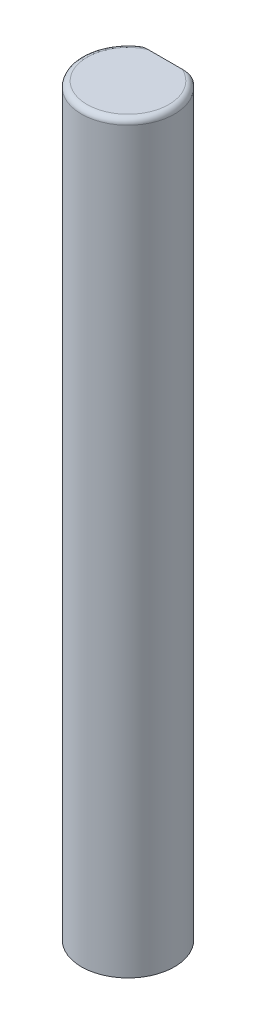
ISO-10303-21;
HEADER;
FILE_DESCRIPTION(('STEP AP214'),'2;1');
FILE_NAME('part.step','',(''),(''),'','','');
FILE_SCHEMA(('AUTOMOTIVE_DESIGN { 1 0 10303 214 1 1 1 1 }'));
ENDSEC;
DATA;
#1=APPLICATION_CONTEXT('core data for automotive mechanical design processes');
#2=APPLICATION_PROTOCOL_DEFINITION('international standard','automotive_design',2000,#1);
#3=PRODUCT_CONTEXT('',#1,'mechanical');
#4=PRODUCT('Part','Part','',(#3));
#5=PRODUCT_RELATED_PRODUCT_CATEGORY('part','',(#4));
#6=PRODUCT_DEFINITION_FORMATION('','',#4);
#7=PRODUCT_DEFINITION_CONTEXT('part definition',#1,'design');
#8=PRODUCT_DEFINITION('design','',#6,#7);
#9=PRODUCT_DEFINITION_SHAPE('','',#8);
#10=(LENGTH_UNIT() NAMED_UNIT(*) SI_UNIT(.MILLI.,.METRE.));
#11=(NAMED_UNIT(*) PLANE_ANGLE_UNIT() SI_UNIT($,.RADIAN.));
#12=(NAMED_UNIT(*) SI_UNIT($,.STERADIAN.) SOLID_ANGLE_UNIT());
#13=UNCERTAINTY_MEASURE_WITH_UNIT(LENGTH_MEASURE(1.E-05),#10,'distance_accuracy_value','');
#14=(GEOMETRIC_REPRESENTATION_CONTEXT(3) GLOBAL_UNCERTAINTY_ASSIGNED_CONTEXT((#13)) GLOBAL_UNIT_ASSIGNED_CONTEXT((#10,
#11,#12)) REPRESENTATION_CONTEXT('',''));
#15=CARTESIAN_POINT('',(0.,0.,0.));
#16=DIRECTION('',(0.,0.,1.));
#17=DIRECTION('',(1.,0.,0.));
#18=AXIS2_PLACEMENT_3D('',#15,#16,#17);
#19=CARTESIAN_POINT('',(0.,40.,0.));
#20=DIRECTION('',(0.,-1.,0.));
#21=DIRECTION('',(0.,0.,-1.));
#22=AXIS2_PLACEMENT_3D('',#19,#20,#21);
#23=CYLINDRICAL_SURFACE('',#22,2.5);
#24=DIRECTION('',(0.,-1.,0.));
#25=VECTOR('',#24,1.);
#26=CARTESIAN_POINT('',(1.5,40.,-2.));
#27=LINE('',#26,#25);
#28=CARTESIAN_POINT('',(1.5,22.,-2.));
#29=VERTEX_POINT('',#28);
#30=CARTESIAN_POINT('',(1.5,39.7,-2.));
#31=VERTEX_POINT('',#30);
#32=EDGE_CURVE('E85',#29,#31,#27,.F.);
#33=ORIENTED_EDGE('',*,*,#32,.T.);
#34=CARTESIAN_POINT('',(0.,39.7,0.));
#35=DIRECTION('',(0.,1.,0.));
#36=DIRECTION('',(0.,0.,1.));
#37=AXIS2_PLACEMENT_3D('',#34,#35,#36);
#38=CIRCLE('',#37,2.5);
#39=CARTESIAN_POINT('',(-1.5,39.7,-2.));
#40=VERTEX_POINT('',#39);
#41=EDGE_CURVE('E11',#31,#40,#38,.F.);
#42=ORIENTED_EDGE('',*,*,#41,.T.);
#43=DIRECTION('',(0.,-1.,0.));
#44=VECTOR('',#43,1.);
#45=CARTESIAN_POINT('',(-1.5,40.,-2.));
#46=LINE('',#45,#44);
#47=CARTESIAN_POINT('',(-1.5,22.,-2.));
#48=VERTEX_POINT('',#47);
#49=EDGE_CURVE('E77',#40,#48,#46,.T.);
#50=ORIENTED_EDGE('',*,*,#49,.T.);
#51=CARTESIAN_POINT('',(0.,22.,0.));
#52=DIRECTION('',(0.,-1.,0.));
#53=DIRECTION('',(0.,0.,-1.));
#54=AXIS2_PLACEMENT_3D('',#51,#52,#53);
#55=CIRCLE('',#54,2.5);
#56=EDGE_CURVE('E80',#48,#29,#55,.T.);
#57=ORIENTED_EDGE('',*,*,#56,.T.);
#58=EDGE_LOOP('',(#33,#42,#50,#57));
#59=FACE_BOUND('',#58,.T.);
#60=CARTESIAN_POINT('',(0.,0.,0.));
#61=DIRECTION('',(0.,1.,0.));
#62=DIRECTION('',(0.,0.,1.));
#63=AXIS2_PLACEMENT_3D('',#60,#61,#62);
#64=CIRCLE('',#63,2.5);
#65=CARTESIAN_POINT('',(0.,0.,2.5));
#66=VERTEX_POINT('',#65);
#67=EDGE_CURVE('E84',#66,#66,#64,.T.);
#68=ORIENTED_EDGE('',*,*,#67,.T.);
#69=EDGE_LOOP('',(#68));
#70=FACE_BOUND('',#69,.T.);
#71=ADVANCED_FACE('F45',(#59,#70),#23,.T.);
#72=CARTESIAN_POINT('',(0.,40.,0.));
#73=DIRECTION('',(0.,1.,0.));
#74=DIRECTION('',(0.,0.,1.));
#75=AXIS2_PLACEMENT_3D('',#72,#73,#74);
#76=PLANE('',#75);
#77=DIRECTION('',(1.,0.,0.));
#78=VECTOR('',#77,1.);
#79=CARTESIAN_POINT('',(0.,40.,-2.));
#80=LINE('',#79,#78);
#81=CARTESIAN_POINT('',(-0.916515138991167,40.,-2.));
#82=VERTEX_POINT('',#81);
#83=CARTESIAN_POINT('',(0.916515138991167,40.,-2.));
#84=VERTEX_POINT('',#83);
#85=EDGE_CURVE('E93',#82,#84,#80,.T.);
#86=ORIENTED_EDGE('',*,*,#85,.F.);
#87=CARTESIAN_POINT('',(0.,40.,0.));
#88=DIRECTION('',(0.,1.,0.));
#89=DIRECTION('',(0.,0.,1.));
#90=AXIS2_PLACEMENT_3D('',#87,#88,#89);
#91=CIRCLE('',#90,2.2);
#92=EDGE_CURVE('E92',#82,#84,#91,.T.);
#93=ORIENTED_EDGE('',*,*,#92,.T.);
#94=EDGE_LOOP('',(#86,#93));
#95=FACE_BOUND('',#94,.T.);
#96=ADVANCED_FACE('F124',(#95),#76,.T.);
#97=CARTESIAN_POINT('',(0.,0.,0.));
#98=DIRECTION('',(0.,1.,0.));
#99=DIRECTION('',(0.,0.,1.));
#100=AXIS2_PLACEMENT_3D('',#97,#98,#99);
#101=PLANE('',#100);
#102=ORIENTED_EDGE('',*,*,#67,.F.);
#103=EDGE_LOOP('',(#102));
#104=FACE_BOUND('',#103,.T.);
#105=ADVANCED_FACE('F128',(#104),#101,.F.);
#106=CARTESIAN_POINT('',(0.,22.,0.));
#107=DIRECTION('',(0.,-1.,0.));
#108=DIRECTION('',(0.,0.,-1.));
#109=AXIS2_PLACEMENT_3D('',#106,#107,#108);
#110=PLANE('',#109);
#111=DIRECTION('',(1.,0.,0.));
#112=VECTOR('',#111,1.);
#113=CARTESIAN_POINT('',(-4.18033626111919,22.,-2.));
#114=LINE('',#113,#112);
#115=EDGE_CURVE('E90',#48,#29,#114,.T.);
#116=ORIENTED_EDGE('',*,*,#115,.T.);
#117=ORIENTED_EDGE('',*,*,#56,.F.);
#118=EDGE_LOOP('',(#116,#117));
#119=FACE_BOUND('',#118,.T.);
#120=ADVANCED_FACE('F89',(#119),#110,.F.);
#121=CARTESIAN_POINT('',(-4.18033626111919,22.,-2.));
#122=DIRECTION('',(0.,0.,1.));
#123=DIRECTION('',(1.,0.,0.));
#124=AXIS2_PLACEMENT_3D('',#121,#122,#123);
#125=PLANE('',#124);
#126=ORIENTED_EDGE('',*,*,#85,.T.);
#127=CARTESIAN_POINT('',(0.916515138991167,40.,-2.));
#128=CARTESIAN_POINT('',(0.947599932353188,39.9999802781559,-2.));
#129=CARTESIAN_POINT('',(0.978726723755185,39.9991583371961,-2.));
#130=CARTESIAN_POINT('',(1.04114904901983,39.9953409293656,-2.));
#131=CARTESIAN_POINT('',(1.07244321141905,39.9923240672488,-2.));
#132=CARTESIAN_POINT('',(1.13530016344848,39.9834357436092,-2.));
#133=CARTESIAN_POINT('',(1.16685529160907,39.9775069850126,-2.));
#134=CARTESIAN_POINT('',(1.22896142796598,39.9619702273655,-2.));
#135=CARTESIAN_POINT('',(1.25951632891891,39.9523789734728,-2.));
#136=CARTESIAN_POINT('',(1.30498609302567,39.9339859735403,-2.));
#137=CARTESIAN_POINT('',(1.32058513754266,39.9268793109369,-2.));
#138=CARTESIAN_POINT('',(1.35094825217045,39.9110882082432,-2.));
#139=CARTESIAN_POINT('',(1.36571359949593,39.902406272462,-2.));
#140=CARTESIAN_POINT('',(1.39417994478869,39.8831386335402,-2.));
#141=CARTESIAN_POINT('',(1.40786896019233,39.8725349361214,-2.));
#142=CARTESIAN_POINT('',(1.43339489276327,39.8492678734221,-2.));
#143=CARTESIAN_POINT('',(1.44523463649557,39.8366077130376,-2.));
#144=CARTESIAN_POINT('',(1.46285900087057,39.8135106476709,-2.));
#145=CARTESIAN_POINT('',(1.46937509991116,39.8036340536974,-2.));
#146=CARTESIAN_POINT('',(1.48075572808713,39.7829883562342,-2.));
#147=CARTESIAN_POINT('',(1.48562484769663,39.7722218392784,-2.));
#148=CARTESIAN_POINT('',(1.49289524761883,39.7513369085001,-2.));
#149=CARTESIAN_POINT('',(1.49552445714329,39.7412986359284,-2.));
#150=CARTESIAN_POINT('',(1.49909365333132,39.7208492233069,-2.));
#151=CARTESIAN_POINT('',(1.50002041131743,39.7104357990612,-2.));
#152=CARTESIAN_POINT('',(1.5,39.7,-2.));
#153=B_SPLINE_CURVE_WITH_KNOTS('',3,(#127,#128,#129,#130,#131,#132,#133,#134,#135,#136,#137,
#138,#139,#140,#141,#142,#143,#144,#145,#146,#147,#148,#149,#150,#151,#152),.UNSPECIFIED.,.F.,
.F.,(4,2,2,2,2,2,2,2,2,2,2,2,4),(0.,0.0933095818000355,0.187541107399812,0.283705953529211,
0.379436292625799,0.430789597587389,0.482061967156292,0.533841870951632,0.585541839191323,
0.620916553217952,0.656191842077165,0.687182119655989,0.718412200768318),.UNSPECIFIED.);
#154=EDGE_CURVE('E55',#84,#31,#153,.T.);
#155=ORIENTED_EDGE('',*,*,#154,.T.);
#156=ORIENTED_EDGE('',*,*,#32,.F.);
#157=ORIENTED_EDGE('',*,*,#115,.F.);
#158=ORIENTED_EDGE('',*,*,#49,.F.);
#159=CARTESIAN_POINT('',(-1.5,39.7,-2.));
#160=CARTESIAN_POINT('',(-1.50003559102239,39.7121501293466,-2.));
#161=CARTESIAN_POINT('',(-1.49877244515557,39.7242578043947,-2.));
#162=CARTESIAN_POINT('',(-1.49396821102334,39.747879784032,-2.));
#163=CARTESIAN_POINT('',(-1.49045245826753,39.7593991684017,-2.));
#164=CARTESIAN_POINT('',(-1.48146802359068,39.7815772283283,-2.));
#165=CARTESIAN_POINT('',(-1.47600712748122,39.7922391305152,-2.));
#166=CARTESIAN_POINT('',(-1.46350752760729,39.8126179968912,-2.));
#167=CARTESIAN_POINT('',(-1.456464233866,39.8223320918327,-2.));
#168=CARTESIAN_POINT('',(-1.43738334103407,39.8452792916075,-2.));
#169=CARTESIAN_POINT('',(-1.42459542743351,39.8578862283405,-2.));
#170=CARTESIAN_POINT('',(-1.39722905149911,39.8809444992727,-2.));
#171=CARTESIAN_POINT('',(-1.38264768968763,39.8913922676778,-2.));
#172=CARTESIAN_POINT('',(-1.34266383370208,39.9164263629838,-2.));
#173=CARTESIAN_POINT('',(-1.31627379399085,39.929422770141,-2.));
#174=CARTESIAN_POINT('',(-1.26179396651077,39.9514548381852,-2.));
#175=CARTESIAN_POINT('',(-1.23369455307765,39.960465137054,-2.));
#176=CARTESIAN_POINT('',(-1.18142174434979,39.9740641484517,-2.));
#177=CARTESIAN_POINT('',(-1.15737017085927,39.9791383532616,-2.));
#178=CARTESIAN_POINT('',(-1.10892983356083,39.98745850303,-2.));
#179=CARTESIAN_POINT('',(-1.08454068631911,39.9907021578811,-2.));
#180=CARTESIAN_POINT('',(-1.03620042502433,39.9956116756145,-2.));
#181=CARTESIAN_POINT('',(-1.0122527565377,39.9973133621148,-2.));
#182=CARTESIAN_POINT('',(-0.964370980700276,39.9995026233784,-2.));
#183=CARTESIAN_POINT('',(-0.940437042725083,39.999993774153,-2.));
#184=CARTESIAN_POINT('',(-0.916515138991166,40.,-2.));
#185=B_SPLINE_CURVE_WITH_KNOTS('',3,(#159,#160,#161,#162,#163,#164,#165,#166,#167,#168,#169,
#170,#171,#172,#173,#174,#175,#176,#177,#178,#179,#180,#181,#182,#183,#184),.UNSPECIFIED.,.F.,
.F.,(4,2,2,2,2,2,2,2,2,2,2,2,4),(0.,0.0363176162822239,0.0722337652014306,0.10800773912753,
0.143886852064561,0.197454598116364,0.25111011476732,0.338866854323847,0.427174194931269,
0.500835056047567,0.574587867367115,0.646579686809692,0.718358580869713),.UNSPECIFIED.);
#186=EDGE_CURVE('E109',#40,#82,#185,.T.);
#187=ORIENTED_EDGE('',*,*,#186,.T.);
#188=EDGE_LOOP('',(#126,#155,#156,#157,#158,#187));
#189=FACE_BOUND('',#188,.T.);
#190=ADVANCED_FACE('F95',(#189),#125,.F.);
#191=CARTESIAN_POINT('',(0.,39.7,0.));
#192=DIRECTION('',(0.,1.,0.));
#193=DIRECTION('',(0.,0.,1.));
#194=AXIS2_PLACEMENT_3D('',#191,#192,#193);
#195=TOROIDAL_SURFACE('',#194,2.2,0.3);
#196=ORIENTED_EDGE('',*,*,#186,.F.);
#197=ORIENTED_EDGE('',*,*,#41,.F.);
#198=ORIENTED_EDGE('',*,*,#154,.F.);
#199=ORIENTED_EDGE('',*,*,#92,.F.);
#200=EDGE_LOOP('',(#196,#197,#198,#199));
#201=FACE_BOUND('',#200,.T.);
#202=ADVANCED_FACE('F47',(#201),#195,.T.);
#203=CLOSED_SHELL('',(#71,#96,#105,#120,#190,#202));
#204=MANIFOLD_SOLID_BREP('B2',#203);
#205=ADVANCED_BREP_SHAPE_REPRESENTATION('',(#18,#204),#14);
#206=SHAPE_DEFINITION_REPRESENTATION(#9,#205);
ENDSEC;
END-ISO-10303-21;
